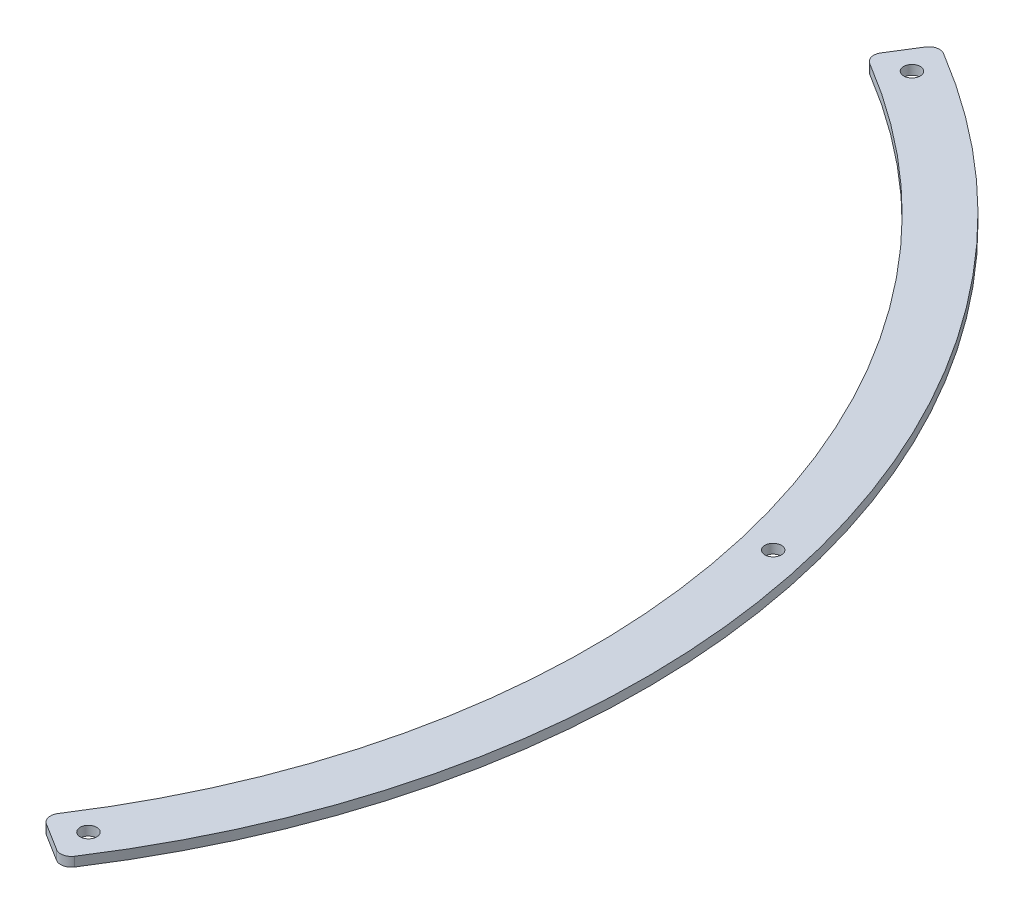
ISO-10303-21;
HEADER;
FILE_DESCRIPTION(('STEP AP214'),'2;1');
FILE_NAME('part.step','',(''),(''),'','','');
FILE_SCHEMA(('AUTOMOTIVE_DESIGN { 1 0 10303 214 1 1 1 1 }'));
ENDSEC;
DATA;
#1=APPLICATION_CONTEXT('core data for automotive mechanical design processes');
#2=APPLICATION_PROTOCOL_DEFINITION('international standard','automotive_design',2000,#1);
#3=PRODUCT_CONTEXT('',#1,'mechanical');
#4=PRODUCT('Part','Part','',(#3));
#5=PRODUCT_RELATED_PRODUCT_CATEGORY('part','',(#4));
#6=PRODUCT_DEFINITION_FORMATION('','',#4);
#7=PRODUCT_DEFINITION_CONTEXT('part definition',#1,'design');
#8=PRODUCT_DEFINITION('design','',#6,#7);
#9=PRODUCT_DEFINITION_SHAPE('','',#8);
#10=(LENGTH_UNIT() NAMED_UNIT(*) SI_UNIT(.MILLI.,.METRE.));
#11=(NAMED_UNIT(*) PLANE_ANGLE_UNIT() SI_UNIT($,.RADIAN.));
#12=(NAMED_UNIT(*) SI_UNIT($,.STERADIAN.) SOLID_ANGLE_UNIT());
#13=UNCERTAINTY_MEASURE_WITH_UNIT(LENGTH_MEASURE(1.E-05),#10,'distance_accuracy_value','');
#14=(GEOMETRIC_REPRESENTATION_CONTEXT(3) GLOBAL_UNCERTAINTY_ASSIGNED_CONTEXT((#13)) GLOBAL_UNIT_ASSIGNED_CONTEXT((#10,
#11,#12)) REPRESENTATION_CONTEXT('',''));
#15=CARTESIAN_POINT('',(0.,0.,0.));
#16=DIRECTION('',(0.,0.,1.));
#17=DIRECTION('',(1.,0.,0.));
#18=AXIS2_PLACEMENT_3D('',#15,#16,#17);
#19=CARTESIAN_POINT('',(123.895572543055,1.75,80.9560813295002));
#20=DIRECTION('',(0.,-1.,0.));
#21=DIRECTION('',(0.,0.,-1.));
#22=AXIS2_PLACEMENT_3D('',#19,#20,#21);
#23=CYLINDRICAL_SURFACE('',#22,2.00000000000003);
#24=CARTESIAN_POINT('',(123.895572543055,0.,80.9560813295002));
#25=DIRECTION('',(0.,1.,0.));
#26=DIRECTION('',(0.,0.,1.));
#27=AXIS2_PLACEMENT_3D('',#24,#25,#26);
#28=CIRCLE('',#27,2.00000000000003);
#29=CARTESIAN_POINT('',(122.835734014588,0.,82.6521775218131));
#30=VERTEX_POINT('',#29);
#31=CARTESIAN_POINT('',(125.56983703688,0.,82.0500824285476));
#32=VERTEX_POINT('',#31);
#33=EDGE_CURVE('E129',#30,#32,#28,.T.);
#34=ORIENTED_EDGE('',*,*,#33,.T.);
#35=DIRECTION('',(0.,-1.,0.));
#36=VECTOR('',#35,1.);
#37=CARTESIAN_POINT('',(125.56983703688,1.75,82.0500824285476));
#38=LINE('',#37,#36);
#39=CARTESIAN_POINT('',(125.56983703688,1.75,82.0500824285476));
#40=VERTEX_POINT('',#39);
#41=EDGE_CURVE('E11',#40,#32,#38,.T.);
#42=ORIENTED_EDGE('',*,*,#41,.F.);
#43=CARTESIAN_POINT('',(123.895572543055,1.75,80.9560813295002));
#44=DIRECTION('',(0.,1.,0.));
#45=DIRECTION('',(0.,0.,1.));
#46=AXIS2_PLACEMENT_3D('',#43,#44,#45);
#47=CIRCLE('',#46,2.00000000000003);
#48=CARTESIAN_POINT('',(122.835734014588,1.75,82.6521775218131));
#49=VERTEX_POINT('',#48);
#50=EDGE_CURVE('E144',#49,#40,#47,.T.);
#51=ORIENTED_EDGE('',*,*,#50,.F.);
#52=DIRECTION('',(0.,-1.,0.));
#53=VECTOR('',#52,1.);
#54=CARTESIAN_POINT('',(122.835734014588,1.75,82.6521775218131));
#55=LINE('',#54,#53);
#56=EDGE_CURVE('E125',#49,#30,#55,.T.);
#57=ORIENTED_EDGE('',*,*,#56,.T.);
#58=EDGE_LOOP('',(#34,#42,#51,#57));
#59=FACE_BOUND('',#58,.T.);
#60=ADVANCED_FACE('F33',(#59),#23,.T.);
#61=CARTESIAN_POINT('',(0.,1.75,0.));
#62=DIRECTION('',(0.,-1.,0.));
#63=DIRECTION('',(0.,0.,-1.));
#64=AXIS2_PLACEMENT_3D('',#61,#62,#63);
#65=CYLINDRICAL_SURFACE('',#64,150.);
#66=CARTESIAN_POINT('',(0.,0.,0.));
#67=DIRECTION('',(0.,1.,0.));
#68=DIRECTION('',(0.,0.,1.));
#69=AXIS2_PLACEMENT_3D('',#66,#67,#68);
#70=CIRCLE('',#69,150.);
#71=CARTESIAN_POINT('',(76.8930331951634,0.,-128.792319049109));
#72=VERTEX_POINT('',#71);
#73=EDGE_CURVE('E132',#32,#72,#70,.T.);
#74=ORIENTED_EDGE('',*,*,#73,.T.);
#75=DIRECTION('',(0.,-1.,0.));
#76=VECTOR('',#75,1.);
#77=CARTESIAN_POINT('',(76.8930331951634,1.75,-128.792319049109));
#78=LINE('',#77,#76);
#79=CARTESIAN_POINT('',(76.8930331951634,1.75,-128.792319049109));
#80=VERTEX_POINT('',#79);
#81=EDGE_CURVE('E41',#80,#72,#78,.T.);
#82=ORIENTED_EDGE('',*,*,#81,.F.);
#83=CARTESIAN_POINT('',(0.,1.75,0.));
#84=DIRECTION('',(0.,1.,0.));
#85=DIRECTION('',(0.,0.,1.));
#86=AXIS2_PLACEMENT_3D('',#83,#84,#85);
#87=CIRCLE('',#86,150.);
#88=EDGE_CURVE('E92',#40,#80,#87,.T.);
#89=ORIENTED_EDGE('',*,*,#88,.F.);
#90=ORIENTED_EDGE('',*,*,#41,.T.);
#91=EDGE_LOOP('',(#74,#82,#89,#90));
#92=FACE_BOUND('',#91,.T.);
#93=ADVANCED_FACE('F222',(#92),#65,.T.);
#94=CARTESIAN_POINT('',(75.8677927525612,1.75,-127.075088128454));
#95=DIRECTION('',(0.,-1.,0.));
#96=DIRECTION('',(0.,0.,-1.));
#97=AXIS2_PLACEMENT_3D('',#94,#95,#96);
#98=CYLINDRICAL_SURFACE('',#97,2.00000000000006);
#99=CARTESIAN_POINT('',(75.8677927525612,0.,-127.075088128454));
#100=DIRECTION('',(0.,1.,0.));
#101=DIRECTION('',(0.,0.,-1.));
#102=AXIS2_PLACEMENT_3D('',#99,#100,#101);
#103=CIRCLE('',#102,2.00000000000006);
#104=CARTESIAN_POINT('',(74.1716965602483,0.,-128.134926656921));
#105=VERTEX_POINT('',#104);
#106=EDGE_CURVE('E135',#72,#105,#103,.T.);
#107=ORIENTED_EDGE('',*,*,#106,.T.);
#108=DIRECTION('',(0.,-1.,0.));
#109=VECTOR('',#108,1.);
#110=CARTESIAN_POINT('',(74.1716965602483,1.75,-128.134926656921));
#111=LINE('',#110,#109);
#112=CARTESIAN_POINT('',(74.1716965602483,1.75,-128.134926656921));
#113=VERTEX_POINT('',#112);
#114=EDGE_CURVE('E151',#113,#105,#111,.T.);
#115=ORIENTED_EDGE('',*,*,#114,.F.);
#116=CARTESIAN_POINT('',(75.8677927525612,1.75,-127.075088128454));
#117=DIRECTION('',(0.,1.,0.));
#118=DIRECTION('',(0.,0.,-1.));
#119=AXIS2_PLACEMENT_3D('',#116,#117,#118);
#120=CIRCLE('',#119,2.00000000000006);
#121=EDGE_CURVE('E159',#80,#113,#120,.T.);
#122=ORIENTED_EDGE('',*,*,#121,.F.);
#123=ORIENTED_EDGE('',*,*,#81,.T.);
#124=EDGE_LOOP('',(#107,#115,#122,#123));
#125=FACE_BOUND('',#124,.T.);
#126=ADVANCED_FACE('F157',(#125),#98,.T.);
#127=CARTESIAN_POINT('',(70.9914999499232,1.75,-123.045548212278));
#128=DIRECTION('',(0.848048096156428,0.,0.529919264233202));
#129=DIRECTION('',(0.529919264233202,0.,-0.848048096156428));
#130=AXIS2_PLACEMENT_3D('',#127,#128,#129);
#131=PLANE('',#130);
#132=DIRECTION('',(-0.529919264233202,0.,0.848048096156428));
#133=VECTOR('',#132,1.);
#134=CARTESIAN_POINT('',(70.9914999499232,0.,-123.045548212278));
#135=LINE('',#134,#133);
#136=CARTESIAN_POINT('',(70.9914999499232,0.,-123.045548212278));
#137=VERTEX_POINT('',#136);
#138=EDGE_CURVE('E137',#105,#137,#135,.T.);
#139=ORIENTED_EDGE('',*,*,#138,.T.);
#140=DIRECTION('',(0.,-1.,0.));
#141=VECTOR('',#140,1.);
#142=CARTESIAN_POINT('',(70.9914999499232,1.75,-123.045548212278));
#143=LINE('',#142,#141);
#144=CARTESIAN_POINT('',(70.9914999499232,1.75,-123.045548212278));
#145=VERTEX_POINT('',#144);
#146=EDGE_CURVE('E148',#145,#137,#143,.T.);
#147=ORIENTED_EDGE('',*,*,#146,.F.);
#148=DIRECTION('',(-0.529919264233202,0.,0.848048096156428));
#149=VECTOR('',#148,1.);
#150=CARTESIAN_POINT('',(70.9914999499232,1.75,-123.045548212278));
#151=LINE('',#150,#149);
#152=EDGE_CURVE('E171',#113,#145,#151,.T.);
#153=ORIENTED_EDGE('',*,*,#152,.F.);
#154=ORIENTED_EDGE('',*,*,#114,.T.);
#155=EDGE_LOOP('',(#139,#147,#153,#154));
#156=FACE_BOUND('',#155,.T.);
#157=ADVANCED_FACE('F167',(#156),#131,.F.);
#158=CARTESIAN_POINT('',(72.687596142236,1.75,-121.985709683812));
#159=DIRECTION('',(0.,-1.,0.));
#160=DIRECTION('',(0.,0.,-1.));
#161=AXIS2_PLACEMENT_3D('',#158,#159,#160);
#162=CYLINDRICAL_SURFACE('',#161,2.);
#163=CARTESIAN_POINT('',(72.687596142236,0.,-121.985709683812));
#164=DIRECTION('',(0.,1.,0.));
#165=DIRECTION('',(0.,0.,-1.));
#166=AXIS2_PLACEMENT_3D('',#163,#164,#165);
#167=CIRCLE('',#166,2.);
#168=CARTESIAN_POINT('',(71.6638271824863,0.,-120.267601096716));
#169=VERTEX_POINT('',#168);
#170=EDGE_CURVE('E139',#137,#169,#167,.T.);
#171=ORIENTED_EDGE('',*,*,#170,.T.);
#172=DIRECTION('',(0.,-1.,0.));
#173=VECTOR('',#172,1.);
#174=CARTESIAN_POINT('',(71.6638271824863,1.75,-120.267601096716));
#175=LINE('',#174,#173);
#176=CARTESIAN_POINT('',(71.6638271824863,1.75,-120.267601096716));
#177=VERTEX_POINT('',#176);
#178=EDGE_CURVE('E120',#177,#169,#175,.T.);
#179=ORIENTED_EDGE('',*,*,#178,.F.);
#180=CARTESIAN_POINT('',(72.687596142236,1.75,-121.985709683812));
#181=DIRECTION('',(0.,1.,0.));
#182=DIRECTION('',(0.,0.,-1.));
#183=AXIS2_PLACEMENT_3D('',#180,#181,#182);
#184=CIRCLE('',#183,2.);
#185=EDGE_CURVE('E111',#145,#177,#184,.T.);
#186=ORIENTED_EDGE('',*,*,#185,.F.);
#187=ORIENTED_EDGE('',*,*,#146,.T.);
#188=EDGE_LOOP('',(#171,#179,#186,#187));
#189=FACE_BOUND('',#188,.T.);
#190=ADVANCED_FACE('F170',(#189),#162,.T.);
#191=CARTESIAN_POINT('',(0.,1.75,0.));
#192=DIRECTION('',(0.,-1.,0.));
#193=DIRECTION('',(0.,0.,-1.));
#194=AXIS2_PLACEMENT_3D('',#191,#192,#193);
#195=CYLINDRICAL_SURFACE('',#194,140.);
#196=CARTESIAN_POINT('',(0.,0.,0.));
#197=DIRECTION('',(0.,-1.,0.));
#198=DIRECTION('',(0.,0.,1.));
#199=AXIS2_PLACEMENT_3D('',#196,#197,#198);
#200=CIRCLE('',#199,140.);
#201=CARTESIAN_POINT('',(117.13286742097,0.,76.6804497231304));
#202=VERTEX_POINT('',#201);
#203=EDGE_CURVE('E119',#169,#202,#200,.T.);
#204=ORIENTED_EDGE('',*,*,#203,.T.);
#205=DIRECTION('',(0.,-1.,0.));
#206=VECTOR('',#205,1.);
#207=CARTESIAN_POINT('',(117.13286742097,1.75,76.6804497231304));
#208=LINE('',#207,#206);
#209=CARTESIAN_POINT('',(117.13286742097,1.75,76.6804497231304));
#210=VERTEX_POINT('',#209);
#211=EDGE_CURVE('E116',#210,#202,#208,.T.);
#212=ORIENTED_EDGE('',*,*,#211,.F.);
#213=CARTESIAN_POINT('',(0.,1.75,0.));
#214=DIRECTION('',(0.,-1.,0.));
#215=DIRECTION('',(0.,0.,1.));
#216=AXIS2_PLACEMENT_3D('',#213,#214,#215);
#217=CIRCLE('',#216,140.);
#218=EDGE_CURVE('E105',#177,#210,#217,.T.);
#219=ORIENTED_EDGE('',*,*,#218,.F.);
#220=ORIENTED_EDGE('',*,*,#178,.T.);
#221=EDGE_LOOP('',(#204,#212,#219,#220));
#222=FACE_BOUND('',#221,.T.);
#223=ADVANCED_FACE('F117',(#222),#195,.F.);
#224=CARTESIAN_POINT('',(118.806194098412,1.75,77.7758847191751));
#225=DIRECTION('',(0.,-1.,0.));
#226=DIRECTION('',(0.,0.,-1.));
#227=AXIS2_PLACEMENT_3D('',#224,#225,#226);
#228=CYLINDRICAL_SURFACE('',#227,1.99999999999999);
#229=CARTESIAN_POINT('',(118.806194098412,0.,77.7758847191751));
#230=DIRECTION('',(0.,1.,0.));
#231=DIRECTION('',(0.,0.,1.));
#232=AXIS2_PLACEMENT_3D('',#229,#230,#231);
#233=CIRCLE('',#232,1.99999999999999);
#234=CARTESIAN_POINT('',(117.746355569946,0.,79.471980911488));
#235=VERTEX_POINT('',#234);
#236=EDGE_CURVE('E78',#202,#235,#233,.T.);
#237=ORIENTED_EDGE('',*,*,#236,.T.);
#238=DIRECTION('',(0.,-1.,0.));
#239=VECTOR('',#238,1.);
#240=CARTESIAN_POINT('',(117.746355569946,1.75,79.471980911488));
#241=LINE('',#240,#239);
#242=CARTESIAN_POINT('',(117.746355569946,1.75,79.471980911488));
#243=VERTEX_POINT('',#242);
#244=EDGE_CURVE('E121',#243,#235,#241,.T.);
#245=ORIENTED_EDGE('',*,*,#244,.F.);
#246=CARTESIAN_POINT('',(118.806194098412,1.75,77.7758847191751));
#247=DIRECTION('',(0.,1.,0.));
#248=DIRECTION('',(0.,0.,1.));
#249=AXIS2_PLACEMENT_3D('',#246,#247,#248);
#250=CIRCLE('',#249,1.99999999999999);
#251=EDGE_CURVE('E109',#210,#243,#250,.T.);
#252=ORIENTED_EDGE('',*,*,#251,.F.);
#253=ORIENTED_EDGE('',*,*,#211,.T.);
#254=EDGE_LOOP('',(#237,#245,#252,#253));
#255=FACE_BOUND('',#254,.T.);
#256=ADVANCED_FACE('F123',(#255),#228,.T.);
#257=CARTESIAN_POINT('',(117.746355569946,1.75,79.471980911488));
#258=DIRECTION('',(0.529919264233206,0.,-0.848048096156425));
#259=DIRECTION('',(-0.848048096156425,0.,-0.529919264233206));
#260=AXIS2_PLACEMENT_3D('',#257,#258,#259);
#261=PLANE('',#260);
#262=DIRECTION('',(0.848048096156425,0.,0.529919264233206));
#263=VECTOR('',#262,1.);
#264=CARTESIAN_POINT('',(117.746355569946,0.,79.471980911488));
#265=LINE('',#264,#263);
#266=EDGE_CURVE('E84',#235,#30,#265,.T.);
#267=ORIENTED_EDGE('',*,*,#266,.T.);
#268=ORIENTED_EDGE('',*,*,#56,.F.);
#269=DIRECTION('',(0.848048096156425,0.,0.529919264233206));
#270=VECTOR('',#269,1.);
#271=CARTESIAN_POINT('',(117.746355569946,1.75,79.471980911488));
#272=LINE('',#271,#270);
#273=EDGE_CURVE('E49',#243,#49,#272,.T.);
#274=ORIENTED_EDGE('',*,*,#273,.F.);
#275=ORIENTED_EDGE('',*,*,#244,.T.);
#276=EDGE_LOOP('',(#267,#268,#274,#275));
#277=FACE_BOUND('',#276,.T.);
#278=ADVANCED_FACE('F200',(#277),#261,.F.);
#279=CARTESIAN_POINT('',(123.895572543055,1.75,80.9560813295002));
#280=DIRECTION('',(0.,1.,0.));
#281=DIRECTION('',(0.,0.,1.));
#282=AXIS2_PLACEMENT_3D('',#279,#280,#281);
#283=PLANE('',#282);
#284=CARTESIAN_POINT('',(76.8382933138144,1.75,-122.966973942682));
#285=DIRECTION('',(0.,1.,0.));
#286=DIRECTION('',(0.,0.,1.));
#287=AXIS2_PLACEMENT_3D('',#284,#285,#286);
#288=CIRCLE('',#287,1.54999999999999);
#289=CARTESIAN_POINT('',(76.8382933138144,1.75,-121.416973942682));
#290=VERTEX_POINT('',#289);
#291=EDGE_CURVE('E191',#290,#290,#288,.T.);
#292=ORIENTED_EDGE('',*,*,#291,.F.);
#293=EDGE_LOOP('',(#292));
#294=FACE_BOUND('',#293,.T.);
#295=CARTESIAN_POINT('',(141.283659393859,1.75,-32.6179028798605));
#296=DIRECTION('',(0.,1.,0.));
#297=DIRECTION('',(0.,0.,1.));
#298=AXIS2_PLACEMENT_3D('',#295,#296,#297);
#299=CIRCLE('',#298,1.54999999999999);
#300=CARTESIAN_POINT('',(141.283659393859,1.75,-31.0679028798605));
#301=VERTEX_POINT('',#300);
#302=EDGE_CURVE('E185',#301,#301,#299,.T.);
#303=ORIENTED_EDGE('',*,*,#302,.F.);
#304=EDGE_LOOP('',(#303));
#305=FACE_BOUND('',#304,.T.);
#306=CARTESIAN_POINT('',(122.966973942682,1.75,76.8382933138148));
#307=DIRECTION('',(0.,1.,0.));
#308=DIRECTION('',(0.,0.,1.));
#309=AXIS2_PLACEMENT_3D('',#306,#307,#308);
#310=CIRCLE('',#309,1.54999999999999);
#311=CARTESIAN_POINT('',(122.966973942682,1.75,78.3882933138148));
#312=VERTEX_POINT('',#311);
#313=EDGE_CURVE('E179',#312,#312,#310,.T.);
#314=ORIENTED_EDGE('',*,*,#313,.F.);
#315=EDGE_LOOP('',(#314));
#316=FACE_BOUND('',#315,.T.);
#317=ORIENTED_EDGE('',*,*,#50,.T.);
#318=ORIENTED_EDGE('',*,*,#88,.T.);
#319=ORIENTED_EDGE('',*,*,#121,.T.);
#320=ORIENTED_EDGE('',*,*,#152,.T.);
#321=ORIENTED_EDGE('',*,*,#185,.T.);
#322=ORIENTED_EDGE('',*,*,#218,.T.);
#323=ORIENTED_EDGE('',*,*,#251,.T.);
#324=ORIENTED_EDGE('',*,*,#273,.T.);
#325=EDGE_LOOP('',(#317,#318,#319,#320,#321,#322,#323,#324));
#326=FACE_BOUND('',#325,.T.);
#327=ADVANCED_FACE('F107',(#294,#305,#316,#326),#283,.T.);
#328=CARTESIAN_POINT('',(123.895572543055,0.,80.9560813295002));
#329=DIRECTION('',(0.,1.,0.));
#330=DIRECTION('',(0.,0.,1.));
#331=AXIS2_PLACEMENT_3D('',#328,#329,#330);
#332=PLANE('',#331);
#333=CARTESIAN_POINT('',(76.8382933138144,0.,-122.966973942682));
#334=DIRECTION('',(0.,1.,0.));
#335=DIRECTION('',(0.,0.,1.));
#336=AXIS2_PLACEMENT_3D('',#333,#334,#335);
#337=CIRCLE('',#336,1.54999999999999);
#338=CARTESIAN_POINT('',(76.8382933138144,0.,-121.416973942682));
#339=VERTEX_POINT('',#338);
#340=EDGE_CURVE('E188',#339,#339,#337,.F.);
#341=ORIENTED_EDGE('',*,*,#340,.F.);
#342=EDGE_LOOP('',(#341));
#343=FACE_BOUND('',#342,.T.);
#344=CARTESIAN_POINT('',(141.283659393859,0.,-32.6179028798605));
#345=DIRECTION('',(0.,1.,0.));
#346=DIRECTION('',(0.,0.,1.));
#347=AXIS2_PLACEMENT_3D('',#344,#345,#346);
#348=CIRCLE('',#347,1.54999999999999);
#349=CARTESIAN_POINT('',(141.283659393859,0.,-31.0679028798605));
#350=VERTEX_POINT('',#349);
#351=EDGE_CURVE('E182',#350,#350,#348,.F.);
#352=ORIENTED_EDGE('',*,*,#351,.F.);
#353=EDGE_LOOP('',(#352));
#354=FACE_BOUND('',#353,.T.);
#355=CARTESIAN_POINT('',(122.966973942682,0.,76.8382933138148));
#356=DIRECTION('',(0.,1.,0.));
#357=DIRECTION('',(0.,0.,1.));
#358=AXIS2_PLACEMENT_3D('',#355,#356,#357);
#359=CIRCLE('',#358,1.54999999999999);
#360=CARTESIAN_POINT('',(122.966973942682,0.,78.3882933138148));
#361=VERTEX_POINT('',#360);
#362=EDGE_CURVE('E133',#361,#361,#359,.F.);
#363=ORIENTED_EDGE('',*,*,#362,.F.);
#364=EDGE_LOOP('',(#363));
#365=FACE_BOUND('',#364,.T.);
#366=ORIENTED_EDGE('',*,*,#33,.F.);
#367=ORIENTED_EDGE('',*,*,#266,.F.);
#368=ORIENTED_EDGE('',*,*,#236,.F.);
#369=ORIENTED_EDGE('',*,*,#203,.F.);
#370=ORIENTED_EDGE('',*,*,#170,.F.);
#371=ORIENTED_EDGE('',*,*,#138,.F.);
#372=ORIENTED_EDGE('',*,*,#106,.F.);
#373=ORIENTED_EDGE('',*,*,#73,.F.);
#374=EDGE_LOOP('',(#366,#367,#368,#369,#370,#371,#372,#373));
#375=FACE_BOUND('',#374,.T.);
#376=ADVANCED_FACE('F163',(#343,#354,#365,#375),#332,.F.);
#377=CARTESIAN_POINT('',(122.966973942682,-0.000999999999999916,76.8382933138148));
#378=DIRECTION('',(0.,1.,0.));
#379=DIRECTION('',(0.,0.,1.));
#380=AXIS2_PLACEMENT_3D('',#377,#378,#379);
#381=CYLINDRICAL_SURFACE('',#380,1.54999999999999);
#382=CARTESIAN_POINT('',(122.966973942682,1.75,78.3882933138148));
#383=CARTESIAN_POINT('',(122.966973942682,1.73177083333333,78.3882933138148));
#384=CARTESIAN_POINT('',(122.966973942682,1.71354166666667,78.3882933138148));
#385=CARTESIAN_POINT('',(122.966973942682,1.67708333333333,78.3882933138148));
#386=CARTESIAN_POINT('',(122.966973942682,1.65885416666667,78.3882933138148));
#387=CARTESIAN_POINT('',(122.966973942682,1.62239583333333,78.3882933138148));
#388=CARTESIAN_POINT('',(122.966973942682,1.60416666666667,78.3882933138148));
#389=CARTESIAN_POINT('',(122.966973942682,1.56770833333333,78.3882933138148));
#390=CARTESIAN_POINT('',(122.966973942682,1.54947916666667,78.3882933138148));
#391=CARTESIAN_POINT('',(122.966973942682,1.51302083333333,78.3882933138148));
#392=CARTESIAN_POINT('',(122.966973942682,1.49479166666667,78.3882933138148));
#393=CARTESIAN_POINT('',(122.966973942682,1.45833333333333,78.3882933138148));
#394=CARTESIAN_POINT('',(122.966973942682,1.44010416666667,78.3882933138148));
#395=CARTESIAN_POINT('',(122.966973942682,1.40364583333333,78.3882933138148));
#396=CARTESIAN_POINT('',(122.966973942682,1.38541666666667,78.3882933138148));
#397=CARTESIAN_POINT('',(122.966973942682,1.34895833333333,78.3882933138148));
#398=CARTESIAN_POINT('',(122.966973942682,1.33072916666667,78.3882933138148));
#399=CARTESIAN_POINT('',(122.966973942682,1.29427083333333,78.3882933138148));
#400=CARTESIAN_POINT('',(122.966973942682,1.27604166666667,78.3882933138148));
#401=CARTESIAN_POINT('',(122.966973942682,1.23958333333333,78.3882933138148));
#402=CARTESIAN_POINT('',(122.966973942682,1.22135416666667,78.3882933138148));
#403=CARTESIAN_POINT('',(122.966973942682,1.18489583333333,78.3882933138148));
#404=CARTESIAN_POINT('',(122.966973942682,1.16666666666667,78.3882933138148));
#405=CARTESIAN_POINT('',(122.966973942682,1.13020833333333,78.3882933138148));
#406=CARTESIAN_POINT('',(122.966973942682,1.11197916666667,78.3882933138148));
#407=CARTESIAN_POINT('',(122.966973942682,1.07552083333333,78.3882933138148));
#408=CARTESIAN_POINT('',(122.966973942682,1.05729166666667,78.3882933138148));
#409=CARTESIAN_POINT('',(122.966973942682,1.02083333333333,78.3882933138148));
#410=CARTESIAN_POINT('',(122.966973942682,1.00260416666667,78.3882933138148));
#411=CARTESIAN_POINT('',(122.966973942682,0.966145833333333,78.3882933138148));
#412=CARTESIAN_POINT('',(122.966973942682,0.947916666666667,78.3882933138148));
#413=CARTESIAN_POINT('',(122.966973942682,0.911458333333333,78.3882933138148));
#414=CARTESIAN_POINT('',(122.966973942682,0.893229166666667,78.3882933138148));
#415=CARTESIAN_POINT('',(122.966973942682,0.856770833333333,78.3882933138148));
#416=CARTESIAN_POINT('',(122.966973942682,0.838541666666667,78.3882933138148));
#417=CARTESIAN_POINT('',(122.966973942682,0.802083333333333,78.3882933138148));
#418=CARTESIAN_POINT('',(122.966973942682,0.783854166666667,78.3882933138148));
#419=CARTESIAN_POINT('',(122.966973942682,0.747395833333333,78.3882933138148));
#420=CARTESIAN_POINT('',(122.966973942682,0.729166666666667,78.3882933138148));
#421=CARTESIAN_POINT('',(122.966973942682,0.692708333333333,78.3882933138148));
#422=CARTESIAN_POINT('',(122.966973942682,0.674479166666667,78.3882933138148));
#423=CARTESIAN_POINT('',(122.966973942682,0.638020833333333,78.3882933138148));
#424=CARTESIAN_POINT('',(122.966973942682,0.619791666666667,78.3882933138148));
#425=CARTESIAN_POINT('',(122.966973942682,0.583333333333333,78.3882933138148));
#426=CARTESIAN_POINT('',(122.966973942682,0.565104166666667,78.3882933138148));
#427=CARTESIAN_POINT('',(122.966973942682,0.528645833333333,78.3882933138148));
#428=CARTESIAN_POINT('',(122.966973942682,0.510416666666667,78.3882933138148));
#429=CARTESIAN_POINT('',(122.966973942682,0.473958333333333,78.3882933138148));
#430=CARTESIAN_POINT('',(122.966973942682,0.455729166666667,78.3882933138148));
#431=CARTESIAN_POINT('',(122.966973942682,0.419270833333333,78.3882933138148));
#432=CARTESIAN_POINT('',(122.966973942682,0.401041666666667,78.3882933138148));
#433=CARTESIAN_POINT('',(122.966973942682,0.364583333333333,78.3882933138148));
#434=CARTESIAN_POINT('',(122.966973942682,0.346354166666667,78.3882933138148));
#435=CARTESIAN_POINT('',(122.966973942682,0.309895833333333,78.3882933138148));
#436=CARTESIAN_POINT('',(122.966973942682,0.291666666666667,78.3882933138148));
#437=CARTESIAN_POINT('',(122.966973942682,0.255208333333333,78.3882933138148));
#438=CARTESIAN_POINT('',(122.966973942682,0.236979166666667,78.3882933138148));
#439=CARTESIAN_POINT('',(122.966973942682,0.200520833333333,78.3882933138148));
#440=CARTESIAN_POINT('',(122.966973942682,0.182291666666667,78.3882933138148));
#441=CARTESIAN_POINT('',(122.966973942682,0.145833333333333,78.3882933138148));
#442=CARTESIAN_POINT('',(122.966973942682,0.127604166666667,78.3882933138148));
#443=CARTESIAN_POINT('',(122.966973942682,0.0911458333333334,78.3882933138148));
#444=CARTESIAN_POINT('',(122.966973942682,0.0729166666666667,78.3882933138148));
#445=CARTESIAN_POINT('',(122.966973942682,0.0364583333333334,78.3882933138148));
#446=CARTESIAN_POINT('',(122.966973942682,0.0182291666666667,78.3882933138148));
#447=CARTESIAN_POINT('',(122.966973942682,0.,78.3882933138148));
#448=B_SPLINE_CURVE_WITH_KNOTS('',3,(#382,#383,#384,#385,#386,#387,#388,#389,#390,#391,#392,
#393,#394,#395,#396,#397,#398,#399,#400,#401,#402,#403,#404,#405,#406,#407,#408,#409,#410,#411,
#412,#413,#414,#415,#416,#417,#418,#419,#420,#421,#422,#423,#424,#425,#426,#427,#428,#429,#430,
#431,#432,#433,#434,#435,#436,#437,#438,#439,#440,#441,#442,#443,#444,#445,#446,#447),
.UNSPECIFIED.,.F.,.F.,(4,2,2,2,2,2,2,2,2,2,2,2,2,2,2,2,2,2,2,2,2,2,2,2,2,2,2,2,2,2,2,2,4),(0.,
0.0546875,0.109375,0.1640625,0.21875,0.2734375,0.328125,0.3828125,0.4375,0.4921875,0.546875,
0.6015625,0.65625,0.7109375,0.765625,0.8203125,0.875,0.9296875,0.984375,1.0390625,1.09375,
1.1484375,1.203125,1.2578125,1.3125,1.3671875,1.421875,1.4765625,1.53125,1.5859375,1.640625,
1.6953125,1.75),.UNSPECIFIED.);
#449=EDGE_CURVE('BSEAM206',#312,#361,#448,.T.);
#450=ORIENTED_EDGE('',*,*,#313,.T.);
#451=ORIENTED_EDGE('',*,*,#362,.T.);
#452=ORIENTED_EDGE('',*,*,#449,.T.);
#453=ORIENTED_EDGE('',*,*,#449,.F.);
#454=EDGE_LOOP('',(#450,#452,#451,#453));
#455=FACE_BOUND('',#454,.T.);
#456=ADVANCED_FACE('F206',(#455),#381,.F.);
#457=CARTESIAN_POINT('',(141.283659393859,-0.000999999999999916,-32.6179028798605));
#458=DIRECTION('',(0.,1.,0.));
#459=DIRECTION('',(0.,0.,1.));
#460=AXIS2_PLACEMENT_3D('',#457,#458,#459);
#461=CYLINDRICAL_SURFACE('',#460,1.54999999999999);
#462=CARTESIAN_POINT('',(141.283659393859,1.75,-31.0679028798605));
#463=CARTESIAN_POINT('',(141.283659393859,1.73177083333333,-31.0679028798605));
#464=CARTESIAN_POINT('',(141.283659393859,1.71354166666667,-31.0679028798605));
#465=CARTESIAN_POINT('',(141.283659393859,1.67708333333333,-31.0679028798605));
#466=CARTESIAN_POINT('',(141.283659393859,1.65885416666667,-31.0679028798605));
#467=CARTESIAN_POINT('',(141.283659393859,1.62239583333333,-31.0679028798605));
#468=CARTESIAN_POINT('',(141.283659393859,1.60416666666667,-31.0679028798605));
#469=CARTESIAN_POINT('',(141.283659393859,1.56770833333333,-31.0679028798605));
#470=CARTESIAN_POINT('',(141.283659393859,1.54947916666667,-31.0679028798605));
#471=CARTESIAN_POINT('',(141.283659393859,1.51302083333333,-31.0679028798605));
#472=CARTESIAN_POINT('',(141.283659393859,1.49479166666667,-31.0679028798605));
#473=CARTESIAN_POINT('',(141.283659393859,1.45833333333333,-31.0679028798605));
#474=CARTESIAN_POINT('',(141.283659393859,1.44010416666667,-31.0679028798605));
#475=CARTESIAN_POINT('',(141.283659393859,1.40364583333333,-31.0679028798605));
#476=CARTESIAN_POINT('',(141.283659393859,1.38541666666667,-31.0679028798605));
#477=CARTESIAN_POINT('',(141.283659393859,1.34895833333333,-31.0679028798605));
#478=CARTESIAN_POINT('',(141.283659393859,1.33072916666667,-31.0679028798605));
#479=CARTESIAN_POINT('',(141.283659393859,1.29427083333333,-31.0679028798605));
#480=CARTESIAN_POINT('',(141.283659393859,1.27604166666667,-31.0679028798605));
#481=CARTESIAN_POINT('',(141.283659393859,1.23958333333333,-31.0679028798605));
#482=CARTESIAN_POINT('',(141.283659393859,1.22135416666667,-31.0679028798605));
#483=CARTESIAN_POINT('',(141.283659393859,1.18489583333333,-31.0679028798605));
#484=CARTESIAN_POINT('',(141.283659393859,1.16666666666667,-31.0679028798605));
#485=CARTESIAN_POINT('',(141.283659393859,1.13020833333333,-31.0679028798605));
#486=CARTESIAN_POINT('',(141.283659393859,1.11197916666667,-31.0679028798605));
#487=CARTESIAN_POINT('',(141.283659393859,1.07552083333333,-31.0679028798605));
#488=CARTESIAN_POINT('',(141.283659393859,1.05729166666667,-31.0679028798605));
#489=CARTESIAN_POINT('',(141.283659393859,1.02083333333333,-31.0679028798605));
#490=CARTESIAN_POINT('',(141.283659393859,1.00260416666667,-31.0679028798605));
#491=CARTESIAN_POINT('',(141.283659393859,0.966145833333333,-31.0679028798605));
#492=CARTESIAN_POINT('',(141.283659393859,0.947916666666667,-31.0679028798605));
#493=CARTESIAN_POINT('',(141.283659393859,0.911458333333333,-31.0679028798605));
#494=CARTESIAN_POINT('',(141.283659393859,0.893229166666667,-31.0679028798605));
#495=CARTESIAN_POINT('',(141.283659393859,0.856770833333333,-31.0679028798605));
#496=CARTESIAN_POINT('',(141.283659393859,0.838541666666667,-31.0679028798605));
#497=CARTESIAN_POINT('',(141.283659393859,0.802083333333333,-31.0679028798605));
#498=CARTESIAN_POINT('',(141.283659393859,0.783854166666667,-31.0679028798605));
#499=CARTESIAN_POINT('',(141.283659393859,0.747395833333333,-31.0679028798605));
#500=CARTESIAN_POINT('',(141.283659393859,0.729166666666667,-31.0679028798605));
#501=CARTESIAN_POINT('',(141.283659393859,0.692708333333333,-31.0679028798605));
#502=CARTESIAN_POINT('',(141.283659393859,0.674479166666667,-31.0679028798605));
#503=CARTESIAN_POINT('',(141.283659393859,0.638020833333333,-31.0679028798605));
#504=CARTESIAN_POINT('',(141.283659393859,0.619791666666667,-31.0679028798605));
#505=CARTESIAN_POINT('',(141.283659393859,0.583333333333333,-31.0679028798605));
#506=CARTESIAN_POINT('',(141.283659393859,0.565104166666667,-31.0679028798605));
#507=CARTESIAN_POINT('',(141.283659393859,0.528645833333333,-31.0679028798605));
#508=CARTESIAN_POINT('',(141.283659393859,0.510416666666667,-31.0679028798605));
#509=CARTESIAN_POINT('',(141.283659393859,0.473958333333333,-31.0679028798605));
#510=CARTESIAN_POINT('',(141.283659393859,0.455729166666667,-31.0679028798605));
#511=CARTESIAN_POINT('',(141.283659393859,0.419270833333333,-31.0679028798605));
#512=CARTESIAN_POINT('',(141.283659393859,0.401041666666667,-31.0679028798605));
#513=CARTESIAN_POINT('',(141.283659393859,0.364583333333333,-31.0679028798605));
#514=CARTESIAN_POINT('',(141.283659393859,0.346354166666667,-31.0679028798605));
#515=CARTESIAN_POINT('',(141.283659393859,0.309895833333333,-31.0679028798605));
#516=CARTESIAN_POINT('',(141.283659393859,0.291666666666667,-31.0679028798605));
#517=CARTESIAN_POINT('',(141.283659393859,0.255208333333333,-31.0679028798605));
#518=CARTESIAN_POINT('',(141.283659393859,0.236979166666667,-31.0679028798605));
#519=CARTESIAN_POINT('',(141.283659393859,0.200520833333333,-31.0679028798605));
#520=CARTESIAN_POINT('',(141.283659393859,0.182291666666667,-31.0679028798605));
#521=CARTESIAN_POINT('',(141.283659393859,0.145833333333333,-31.0679028798605));
#522=CARTESIAN_POINT('',(141.283659393859,0.127604166666667,-31.0679028798605));
#523=CARTESIAN_POINT('',(141.283659393859,0.0911458333333334,-31.0679028798605));
#524=CARTESIAN_POINT('',(141.283659393859,0.0729166666666667,-31.0679028798605));
#525=CARTESIAN_POINT('',(141.283659393859,0.0364583333333334,-31.0679028798605));
#526=CARTESIAN_POINT('',(141.283659393859,0.0182291666666667,-31.0679028798605));
#527=CARTESIAN_POINT('',(141.283659393859,0.,-31.0679028798605));
#528=B_SPLINE_CURVE_WITH_KNOTS('',3,(#462,#463,#464,#465,#466,#467,#468,#469,#470,#471,#472,
#473,#474,#475,#476,#477,#478,#479,#480,#481,#482,#483,#484,#485,#486,#487,#488,#489,#490,#491,
#492,#493,#494,#495,#496,#497,#498,#499,#500,#501,#502,#503,#504,#505,#506,#507,#508,#509,#510,
#511,#512,#513,#514,#515,#516,#517,#518,#519,#520,#521,#522,#523,#524,#525,#526,#527),
.UNSPECIFIED.,.F.,.F.,(4,2,2,2,2,2,2,2,2,2,2,2,2,2,2,2,2,2,2,2,2,2,2,2,2,2,2,2,2,2,2,2,4),(0.,
0.0546875,0.109375,0.1640625,0.21875,0.2734375,0.328125,0.3828125,0.4375,0.4921875,0.546875,
0.6015625,0.65625,0.7109375,0.765625,0.8203125,0.875,0.9296875,0.984375,1.0390625,1.09375,
1.1484375,1.203125,1.2578125,1.3125,1.3671875,1.421875,1.4765625,1.53125,1.5859375,1.640625,
1.6953125,1.75),.UNSPECIFIED.);
#529=EDGE_CURVE('BSEAM209',#301,#350,#528,.T.);
#530=ORIENTED_EDGE('',*,*,#302,.T.);
#531=ORIENTED_EDGE('',*,*,#351,.T.);
#532=ORIENTED_EDGE('',*,*,#529,.T.);
#533=ORIENTED_EDGE('',*,*,#529,.F.);
#534=EDGE_LOOP('',(#530,#532,#531,#533));
#535=FACE_BOUND('',#534,.T.);
#536=ADVANCED_FACE('F209',(#535),#461,.F.);
#537=CARTESIAN_POINT('',(76.8382933138144,-0.000999999999999916,-122.966973942682));
#538=DIRECTION('',(0.,1.,0.));
#539=DIRECTION('',(0.,0.,1.));
#540=AXIS2_PLACEMENT_3D('',#537,#538,#539);
#541=CYLINDRICAL_SURFACE('',#540,1.54999999999999);
#542=CARTESIAN_POINT('',(76.8382933138144,1.75,-121.416973942682));
#543=CARTESIAN_POINT('',(76.8382933138144,1.73177083333333,-121.416973942682));
#544=CARTESIAN_POINT('',(76.8382933138144,1.71354166666667,-121.416973942682));
#545=CARTESIAN_POINT('',(76.8382933138144,1.67708333333333,-121.416973942682));
#546=CARTESIAN_POINT('',(76.8382933138144,1.65885416666667,-121.416973942682));
#547=CARTESIAN_POINT('',(76.8382933138144,1.62239583333333,-121.416973942682));
#548=CARTESIAN_POINT('',(76.8382933138144,1.60416666666667,-121.416973942682));
#549=CARTESIAN_POINT('',(76.8382933138144,1.56770833333333,-121.416973942682));
#550=CARTESIAN_POINT('',(76.8382933138144,1.54947916666667,-121.416973942682));
#551=CARTESIAN_POINT('',(76.8382933138144,1.51302083333333,-121.416973942682));
#552=CARTESIAN_POINT('',(76.8382933138144,1.49479166666667,-121.416973942682));
#553=CARTESIAN_POINT('',(76.8382933138144,1.45833333333333,-121.416973942682));
#554=CARTESIAN_POINT('',(76.8382933138144,1.44010416666667,-121.416973942682));
#555=CARTESIAN_POINT('',(76.8382933138144,1.40364583333333,-121.416973942682));
#556=CARTESIAN_POINT('',(76.8382933138144,1.38541666666667,-121.416973942682));
#557=CARTESIAN_POINT('',(76.8382933138144,1.34895833333333,-121.416973942682));
#558=CARTESIAN_POINT('',(76.8382933138144,1.33072916666667,-121.416973942682));
#559=CARTESIAN_POINT('',(76.8382933138144,1.29427083333333,-121.416973942682));
#560=CARTESIAN_POINT('',(76.8382933138144,1.27604166666667,-121.416973942682));
#561=CARTESIAN_POINT('',(76.8382933138144,1.23958333333333,-121.416973942682));
#562=CARTESIAN_POINT('',(76.8382933138144,1.22135416666667,-121.416973942682));
#563=CARTESIAN_POINT('',(76.8382933138144,1.18489583333333,-121.416973942682));
#564=CARTESIAN_POINT('',(76.8382933138144,1.16666666666667,-121.416973942682));
#565=CARTESIAN_POINT('',(76.8382933138144,1.13020833333333,-121.416973942682));
#566=CARTESIAN_POINT('',(76.8382933138144,1.11197916666667,-121.416973942682));
#567=CARTESIAN_POINT('',(76.8382933138144,1.07552083333333,-121.416973942682));
#568=CARTESIAN_POINT('',(76.8382933138144,1.05729166666667,-121.416973942682));
#569=CARTESIAN_POINT('',(76.8382933138144,1.02083333333333,-121.416973942682));
#570=CARTESIAN_POINT('',(76.8382933138144,1.00260416666667,-121.416973942682));
#571=CARTESIAN_POINT('',(76.8382933138144,0.966145833333333,-121.416973942682));
#572=CARTESIAN_POINT('',(76.8382933138144,0.947916666666667,-121.416973942682));
#573=CARTESIAN_POINT('',(76.8382933138144,0.911458333333333,-121.416973942682));
#574=CARTESIAN_POINT('',(76.8382933138144,0.893229166666667,-121.416973942682));
#575=CARTESIAN_POINT('',(76.8382933138144,0.856770833333333,-121.416973942682));
#576=CARTESIAN_POINT('',(76.8382933138144,0.838541666666667,-121.416973942682));
#577=CARTESIAN_POINT('',(76.8382933138144,0.802083333333333,-121.416973942682));
#578=CARTESIAN_POINT('',(76.8382933138144,0.783854166666667,-121.416973942682));
#579=CARTESIAN_POINT('',(76.8382933138144,0.747395833333333,-121.416973942682));
#580=CARTESIAN_POINT('',(76.8382933138144,0.729166666666667,-121.416973942682));
#581=CARTESIAN_POINT('',(76.8382933138144,0.692708333333333,-121.416973942682));
#582=CARTESIAN_POINT('',(76.8382933138144,0.674479166666667,-121.416973942682));
#583=CARTESIAN_POINT('',(76.8382933138144,0.638020833333333,-121.416973942682));
#584=CARTESIAN_POINT('',(76.8382933138144,0.619791666666667,-121.416973942682));
#585=CARTESIAN_POINT('',(76.8382933138144,0.583333333333333,-121.416973942682));
#586=CARTESIAN_POINT('',(76.8382933138144,0.565104166666667,-121.416973942682));
#587=CARTESIAN_POINT('',(76.8382933138144,0.528645833333333,-121.416973942682));
#588=CARTESIAN_POINT('',(76.8382933138144,0.510416666666667,-121.416973942682));
#589=CARTESIAN_POINT('',(76.8382933138144,0.473958333333333,-121.416973942682));
#590=CARTESIAN_POINT('',(76.8382933138144,0.455729166666667,-121.416973942682));
#591=CARTESIAN_POINT('',(76.8382933138144,0.419270833333333,-121.416973942682));
#592=CARTESIAN_POINT('',(76.8382933138144,0.401041666666667,-121.416973942682));
#593=CARTESIAN_POINT('',(76.8382933138144,0.364583333333333,-121.416973942682));
#594=CARTESIAN_POINT('',(76.8382933138144,0.346354166666667,-121.416973942682));
#595=CARTESIAN_POINT('',(76.8382933138144,0.309895833333333,-121.416973942682));
#596=CARTESIAN_POINT('',(76.8382933138144,0.291666666666667,-121.416973942682));
#597=CARTESIAN_POINT('',(76.8382933138144,0.255208333333333,-121.416973942682));
#598=CARTESIAN_POINT('',(76.8382933138144,0.236979166666667,-121.416973942682));
#599=CARTESIAN_POINT('',(76.8382933138144,0.200520833333333,-121.416973942682));
#600=CARTESIAN_POINT('',(76.8382933138144,0.182291666666667,-121.416973942682));
#601=CARTESIAN_POINT('',(76.8382933138144,0.145833333333333,-121.416973942682));
#602=CARTESIAN_POINT('',(76.8382933138144,0.127604166666667,-121.416973942682));
#603=CARTESIAN_POINT('',(76.8382933138144,0.0911458333333334,-121.416973942682));
#604=CARTESIAN_POINT('',(76.8382933138144,0.0729166666666667,-121.416973942682));
#605=CARTESIAN_POINT('',(76.8382933138144,0.0364583333333334,-121.416973942682));
#606=CARTESIAN_POINT('',(76.8382933138144,0.0182291666666667,-121.416973942682));
#607=CARTESIAN_POINT('',(76.8382933138144,0.,-121.416973942682));
#608=B_SPLINE_CURVE_WITH_KNOTS('',3,(#542,#543,#544,#545,#546,#547,#548,#549,#550,#551,#552,
#553,#554,#555,#556,#557,#558,#559,#560,#561,#562,#563,#564,#565,#566,#567,#568,#569,#570,#571,
#572,#573,#574,#575,#576,#577,#578,#579,#580,#581,#582,#583,#584,#585,#586,#587,#588,#589,#590,
#591,#592,#593,#594,#595,#596,#597,#598,#599,#600,#601,#602,#603,#604,#605,#606,#607),
.UNSPECIFIED.,.F.,.F.,(4,2,2,2,2,2,2,2,2,2,2,2,2,2,2,2,2,2,2,2,2,2,2,2,2,2,2,2,2,2,2,2,4),(0.,
0.0546875,0.109375,0.1640625,0.21875,0.2734375,0.328125,0.3828125,0.4375,0.4921875,0.546875,
0.6015625,0.65625,0.7109375,0.765625,0.8203125,0.875,0.9296875,0.984375,1.0390625,1.09375,
1.1484375,1.203125,1.2578125,1.3125,1.3671875,1.421875,1.4765625,1.53125,1.5859375,1.640625,
1.6953125,1.75),.UNSPECIFIED.);
#609=EDGE_CURVE('BSEAM195',#290,#339,#608,.T.);
#610=ORIENTED_EDGE('',*,*,#291,.T.);
#611=ORIENTED_EDGE('',*,*,#340,.T.);
#612=ORIENTED_EDGE('',*,*,#609,.T.);
#613=ORIENTED_EDGE('',*,*,#609,.F.);
#614=EDGE_LOOP('',(#610,#612,#611,#613));
#615=FACE_BOUND('',#614,.T.);
#616=ADVANCED_FACE('F195',(#615),#541,.F.);
#617=CLOSED_SHELL('',(#60,#93,#126,#157,#190,#223,#256,#278,#327,#376,#456,#536,#616));
#618=MANIFOLD_SOLID_BREP('B2',#617);
#619=ADVANCED_BREP_SHAPE_REPRESENTATION('',(#18,#618),#14);
#620=SHAPE_DEFINITION_REPRESENTATION(#9,#619);
ENDSEC;
END-ISO-10303-21;
